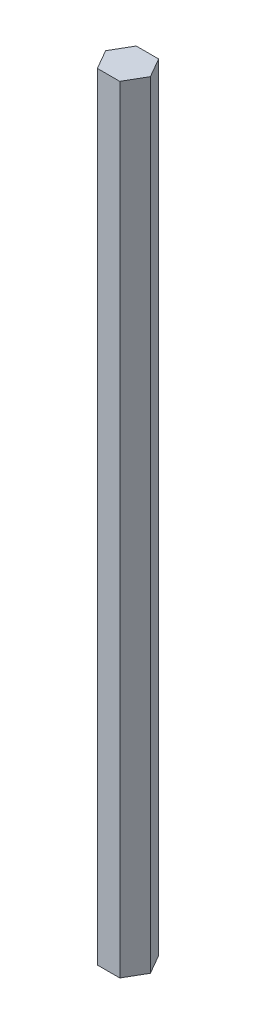
ISO-10303-21;
HEADER;
FILE_DESCRIPTION(('STEP AP214'),'2;1');
FILE_NAME('part.step','',(''),(''),'','','');
FILE_SCHEMA(('AUTOMOTIVE_DESIGN { 1 0 10303 214 1 1 1 1 }'));
ENDSEC;
DATA;
#1=APPLICATION_CONTEXT('core data for automotive mechanical design processes');
#2=APPLICATION_PROTOCOL_DEFINITION('international standard','automotive_design',2000,#1);
#3=PRODUCT_CONTEXT('',#1,'mechanical');
#4=PRODUCT('Part','Part','',(#3));
#5=PRODUCT_RELATED_PRODUCT_CATEGORY('part','',(#4));
#6=PRODUCT_DEFINITION_FORMATION('','',#4);
#7=PRODUCT_DEFINITION_CONTEXT('part definition',#1,'design');
#8=PRODUCT_DEFINITION('design','',#6,#7);
#9=PRODUCT_DEFINITION_SHAPE('','',#8);
#10=(LENGTH_UNIT() NAMED_UNIT(*) SI_UNIT(.MILLI.,.METRE.));
#11=(NAMED_UNIT(*) PLANE_ANGLE_UNIT() SI_UNIT($,.RADIAN.));
#12=(NAMED_UNIT(*) SI_UNIT($,.STERADIAN.) SOLID_ANGLE_UNIT());
#13=UNCERTAINTY_MEASURE_WITH_UNIT(LENGTH_MEASURE(1.E-05),#10,'distance_accuracy_value','');
#14=(GEOMETRIC_REPRESENTATION_CONTEXT(3) GLOBAL_UNCERTAINTY_ASSIGNED_CONTEXT((#13)) GLOBAL_UNIT_ASSIGNED_CONTEXT((#10,
#11,#12)) REPRESENTATION_CONTEXT('',''));
#15=CARTESIAN_POINT('',(0.,0.,0.));
#16=DIRECTION('',(0.,0.,1.));
#17=DIRECTION('',(1.,0.,0.));
#18=AXIS2_PLACEMENT_3D('',#15,#16,#17);
#19=CARTESIAN_POINT('',(7.33234841870824,254.,0.));
#20=DIRECTION('',(-0.866025403784439,0.,0.5));
#21=DIRECTION('',(0.5,0.,0.866025403784439));
#22=AXIS2_PLACEMENT_3D('',#19,#20,#21);
#23=PLANE('',#22);
#24=DIRECTION('',(-0.5,0.,-0.866025403784439));
#25=VECTOR('',#24,1.);
#26=CARTESIAN_POINT('',(7.33234841870824,0.,0.));
#27=LINE('',#26,#25);
#28=CARTESIAN_POINT('',(7.33234841870824,0.,0.));
#29=VERTEX_POINT('',#28);
#30=CARTESIAN_POINT('',(3.66617420935411,0.,-6.35000000000002));
#31=VERTEX_POINT('',#30);
#32=EDGE_CURVE('E117',#29,#31,#27,.T.);
#33=ORIENTED_EDGE('',*,*,#32,.T.);
#34=DIRECTION('',(0.,-1.,0.));
#35=VECTOR('',#34,1.);
#36=CARTESIAN_POINT('',(3.66617420935411,254.,-6.35000000000002));
#37=LINE('',#36,#35);
#38=CARTESIAN_POINT('',(3.66617420935411,254.,-6.35000000000002));
#39=VERTEX_POINT('',#38);
#40=EDGE_CURVE('E11',#39,#31,#37,.T.);
#41=ORIENTED_EDGE('',*,*,#40,.F.);
#42=DIRECTION('',(-0.5,0.,-0.866025403784439));
#43=VECTOR('',#42,1.);
#44=CARTESIAN_POINT('',(7.33234841870824,254.,0.));
#45=LINE('',#44,#43);
#46=CARTESIAN_POINT('',(7.33234841870824,254.,0.));
#47=VERTEX_POINT('',#46);
#48=EDGE_CURVE('E127',#47,#39,#45,.T.);
#49=ORIENTED_EDGE('',*,*,#48,.F.);
#50=DIRECTION('',(0.,-1.,0.));
#51=VECTOR('',#50,1.);
#52=CARTESIAN_POINT('',(7.33234841870824,254.,0.));
#53=LINE('',#52,#51);
#54=EDGE_CURVE('E113',#47,#29,#53,.T.);
#55=ORIENTED_EDGE('',*,*,#54,.T.);
#56=EDGE_LOOP('',(#33,#41,#49,#55));
#57=FACE_BOUND('',#56,.T.);
#58=ADVANCED_FACE('F33',(#57),#23,.F.);
#59=CARTESIAN_POINT('',(3.66617420935411,254.,-6.35000000000002));
#60=DIRECTION('',(0.,0.,1.));
#61=DIRECTION('',(1.,0.,0.));
#62=AXIS2_PLACEMENT_3D('',#59,#60,#61);
#63=PLANE('',#62);
#64=DIRECTION('',(-1.,0.,0.));
#65=VECTOR('',#64,1.);
#66=CARTESIAN_POINT('',(3.66617420935411,0.,-6.35000000000002));
#67=LINE('',#66,#65);
#68=CARTESIAN_POINT('',(-3.66617420935413,0.,-6.35000000000002));
#69=VERTEX_POINT('',#68);
#70=EDGE_CURVE('E120',#31,#69,#67,.T.);
#71=ORIENTED_EDGE('',*,*,#70,.T.);
#72=DIRECTION('',(0.,-1.,0.));
#73=VECTOR('',#72,1.);
#74=CARTESIAN_POINT('',(-3.66617420935413,254.,-6.35000000000002));
#75=LINE('',#74,#73);
#76=CARTESIAN_POINT('',(-3.66617420935413,254.,-6.35000000000002));
#77=VERTEX_POINT('',#76);
#78=EDGE_CURVE('E41',#77,#69,#75,.T.);
#79=ORIENTED_EDGE('',*,*,#78,.F.);
#80=DIRECTION('',(-1.,0.,0.));
#81=VECTOR('',#80,1.);
#82=CARTESIAN_POINT('',(3.66617420935411,254.,-6.35000000000002));
#83=LINE('',#82,#81);
#84=EDGE_CURVE('E86',#39,#77,#83,.T.);
#85=ORIENTED_EDGE('',*,*,#84,.F.);
#86=ORIENTED_EDGE('',*,*,#40,.T.);
#87=EDGE_LOOP('',(#71,#79,#85,#86));
#88=FACE_BOUND('',#87,.T.);
#89=ADVANCED_FACE('F151',(#88),#63,.F.);
#90=CARTESIAN_POINT('',(-3.66617420935413,254.,-6.35000000000002));
#91=DIRECTION('',(0.866025403784439,0.,0.5));
#92=DIRECTION('',(0.5,0.,-0.866025403784439));
#93=AXIS2_PLACEMENT_3D('',#90,#91,#92);
#94=PLANE('',#93);
#95=DIRECTION('',(-0.5,0.,0.866025403784439));
#96=VECTOR('',#95,1.);
#97=CARTESIAN_POINT('',(-3.66617420935413,0.,-6.35000000000002));
#98=LINE('',#97,#96);
#99=CARTESIAN_POINT('',(-7.33234841870826,0.,0.));
#100=VERTEX_POINT('',#99);
#101=EDGE_CURVE('E122',#69,#100,#98,.T.);
#102=ORIENTED_EDGE('',*,*,#101,.T.);
#103=DIRECTION('',(0.,-1.,0.));
#104=VECTOR('',#103,1.);
#105=CARTESIAN_POINT('',(-7.33234841870826,254.,0.));
#106=LINE('',#105,#104);
#107=CARTESIAN_POINT('',(-7.33234841870826,254.,0.));
#108=VERTEX_POINT('',#107);
#109=EDGE_CURVE('E108',#108,#100,#106,.T.);
#110=ORIENTED_EDGE('',*,*,#109,.F.);
#111=DIRECTION('',(-0.5,0.,0.866025403784439));
#112=VECTOR('',#111,1.);
#113=CARTESIAN_POINT('',(-3.66617420935413,254.,-6.35000000000002));
#114=LINE('',#113,#112);
#115=EDGE_CURVE('E99',#77,#108,#114,.T.);
#116=ORIENTED_EDGE('',*,*,#115,.F.);
#117=ORIENTED_EDGE('',*,*,#78,.T.);
#118=EDGE_LOOP('',(#102,#110,#116,#117));
#119=FACE_BOUND('',#118,.T.);
#120=ADVANCED_FACE('F133',(#119),#94,.F.);
#121=CARTESIAN_POINT('',(-7.33234841870826,254.,0.));
#122=DIRECTION('',(0.866025403784439,0.,-0.5));
#123=DIRECTION('',(-0.5,0.,-0.866025403784439));
#124=AXIS2_PLACEMENT_3D('',#121,#122,#123);
#125=PLANE('',#124);
#126=DIRECTION('',(0.5,0.,0.866025403784439));
#127=VECTOR('',#126,1.);
#128=CARTESIAN_POINT('',(-7.33234841870826,0.,0.));
#129=LINE('',#128,#127);
#130=CARTESIAN_POINT('',(-3.66617420935413,0.,6.35000000000001));
#131=VERTEX_POINT('',#130);
#132=EDGE_CURVE('E107',#100,#131,#129,.T.);
#133=ORIENTED_EDGE('',*,*,#132,.T.);
#134=DIRECTION('',(0.,-1.,0.));
#135=VECTOR('',#134,1.);
#136=CARTESIAN_POINT('',(-3.66617420935413,254.,6.35000000000001));
#137=LINE('',#136,#135);
#138=CARTESIAN_POINT('',(-3.66617420935413,254.,6.35000000000001));
#139=VERTEX_POINT('',#138);
#140=EDGE_CURVE('E104',#139,#131,#137,.T.);
#141=ORIENTED_EDGE('',*,*,#140,.F.);
#142=DIRECTION('',(0.5,0.,0.866025403784439));
#143=VECTOR('',#142,1.);
#144=CARTESIAN_POINT('',(-7.33234841870826,254.,0.));
#145=LINE('',#144,#143);
#146=EDGE_CURVE('E93',#108,#139,#145,.T.);
#147=ORIENTED_EDGE('',*,*,#146,.F.);
#148=ORIENTED_EDGE('',*,*,#109,.T.);
#149=EDGE_LOOP('',(#133,#141,#147,#148));
#150=FACE_BOUND('',#149,.T.);
#151=ADVANCED_FACE('F105',(#150),#125,.F.);
#152=CARTESIAN_POINT('',(-3.66617420935413,254.,6.35000000000001));
#153=DIRECTION('',(0.,0.,-1.));
#154=DIRECTION('',(-1.,0.,0.));
#155=AXIS2_PLACEMENT_3D('',#152,#153,#154);
#156=PLANE('',#155);
#157=DIRECTION('',(1.,0.,0.));
#158=VECTOR('',#157,1.);
#159=CARTESIAN_POINT('',(-3.66617420935413,0.,6.35000000000001));
#160=LINE('',#159,#158);
#161=CARTESIAN_POINT('',(3.66617420935412,0.,6.35000000000001));
#162=VERTEX_POINT('',#161);
#163=EDGE_CURVE('E72',#131,#162,#160,.T.);
#164=ORIENTED_EDGE('',*,*,#163,.T.);
#165=DIRECTION('',(0.,-1.,0.));
#166=VECTOR('',#165,1.);
#167=CARTESIAN_POINT('',(3.66617420935412,254.,6.35000000000001));
#168=LINE('',#167,#166);
#169=CARTESIAN_POINT('',(3.66617420935412,254.,6.35000000000001));
#170=VERTEX_POINT('',#169);
#171=EDGE_CURVE('E109',#170,#162,#168,.T.);
#172=ORIENTED_EDGE('',*,*,#171,.F.);
#173=DIRECTION('',(1.,0.,0.));
#174=VECTOR('',#173,1.);
#175=CARTESIAN_POINT('',(-3.66617420935413,254.,6.35000000000001));
#176=LINE('',#175,#174);
#177=EDGE_CURVE('E97',#139,#170,#176,.T.);
#178=ORIENTED_EDGE('',*,*,#177,.F.);
#179=ORIENTED_EDGE('',*,*,#140,.T.);
#180=EDGE_LOOP('',(#164,#172,#178,#179));
#181=FACE_BOUND('',#180,.T.);
#182=ADVANCED_FACE('F111',(#181),#156,.F.);
#183=CARTESIAN_POINT('',(3.66617420935412,254.,6.35000000000001));
#184=DIRECTION('',(-0.866025403784439,0.,-0.5));
#185=DIRECTION('',(-0.5,0.,0.866025403784439));
#186=AXIS2_PLACEMENT_3D('',#183,#184,#185);
#187=PLANE('',#186);
#188=DIRECTION('',(0.5,0.,-0.866025403784439));
#189=VECTOR('',#188,1.);
#190=CARTESIAN_POINT('',(3.66617420935412,0.,6.35000000000001));
#191=LINE('',#190,#189);
#192=EDGE_CURVE('E78',#162,#29,#191,.T.);
#193=ORIENTED_EDGE('',*,*,#192,.T.);
#194=ORIENTED_EDGE('',*,*,#54,.F.);
#195=DIRECTION('',(0.5,0.,-0.866025403784439));
#196=VECTOR('',#195,1.);
#197=CARTESIAN_POINT('',(3.66617420935412,254.,6.35000000000001));
#198=LINE('',#197,#196);
#199=EDGE_CURVE('E49',#170,#47,#198,.T.);
#200=ORIENTED_EDGE('',*,*,#199,.F.);
#201=ORIENTED_EDGE('',*,*,#171,.T.);
#202=EDGE_LOOP('',(#193,#194,#200,#201));
#203=FACE_BOUND('',#202,.T.);
#204=ADVANCED_FACE('F140',(#203),#187,.F.);
#205=CARTESIAN_POINT('',(0.,254.,0.));
#206=DIRECTION('',(0.,1.,0.));
#207=DIRECTION('',(0.,0.,1.));
#208=AXIS2_PLACEMENT_3D('',#205,#206,#207);
#209=PLANE('',#208);
#210=ORIENTED_EDGE('',*,*,#48,.T.);
#211=ORIENTED_EDGE('',*,*,#84,.T.);
#212=ORIENTED_EDGE('',*,*,#115,.T.);
#213=ORIENTED_EDGE('',*,*,#146,.T.);
#214=ORIENTED_EDGE('',*,*,#177,.T.);
#215=ORIENTED_EDGE('',*,*,#199,.T.);
#216=EDGE_LOOP('',(#210,#211,#212,#213,#214,#215));
#217=FACE_BOUND('',#216,.T.);
#218=ADVANCED_FACE('F95',(#217),#209,.T.);
#219=CARTESIAN_POINT('',(0.,0.,0.));
#220=DIRECTION('',(0.,1.,0.));
#221=DIRECTION('',(0.,0.,1.));
#222=AXIS2_PLACEMENT_3D('',#219,#220,#221);
#223=PLANE('',#222);
#224=ORIENTED_EDGE('',*,*,#32,.F.);
#225=ORIENTED_EDGE('',*,*,#192,.F.);
#226=ORIENTED_EDGE('',*,*,#163,.F.);
#227=ORIENTED_EDGE('',*,*,#132,.F.);
#228=ORIENTED_EDGE('',*,*,#101,.F.);
#229=ORIENTED_EDGE('',*,*,#70,.F.);
#230=EDGE_LOOP('',(#224,#225,#226,#227,#228,#229));
#231=FACE_BOUND('',#230,.T.);
#232=ADVANCED_FACE('F136',(#231),#223,.F.);
#233=CLOSED_SHELL('',(#58,#89,#120,#151,#182,#204,#218,#232));
#234=MANIFOLD_SOLID_BREP('B2',#233);
#235=ADVANCED_BREP_SHAPE_REPRESENTATION('',(#18,#234),#14);
#236=SHAPE_DEFINITION_REPRESENTATION(#9,#235);
ENDSEC;
END-ISO-10303-21;
